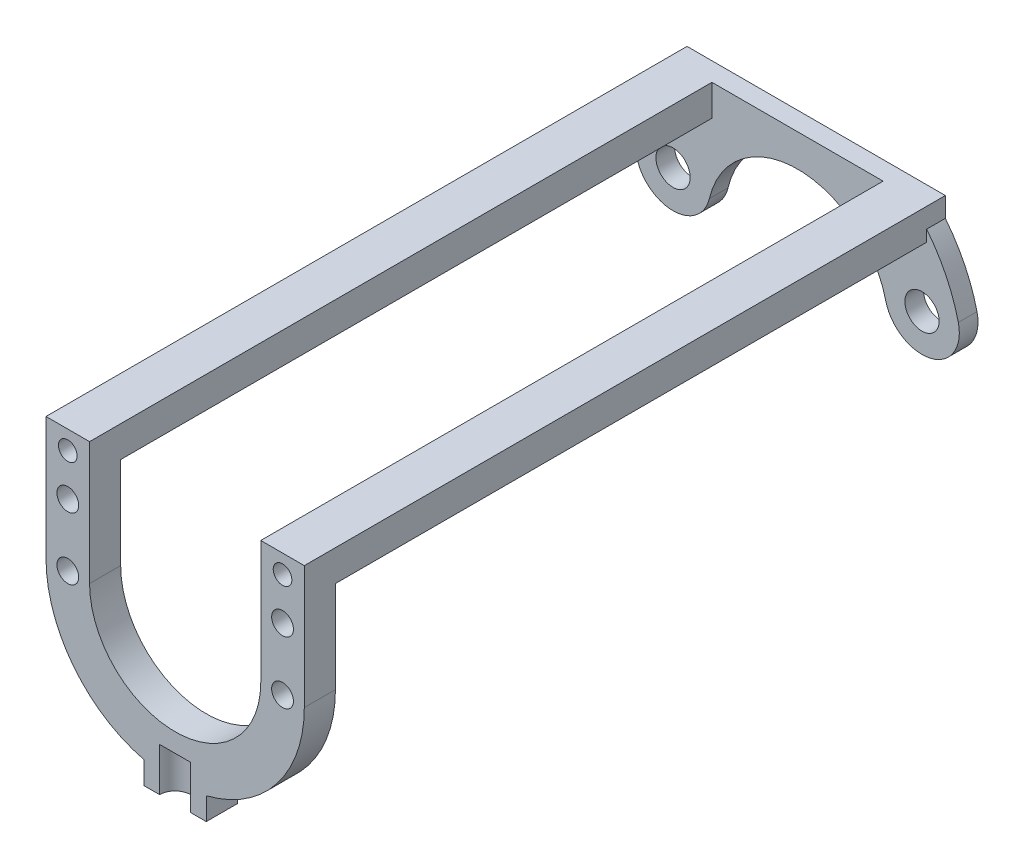
ISO-10303-21;
HEADER;
FILE_DESCRIPTION(('STEP AP214'),'2;1');
FILE_NAME('part.step','',(''),(''),'','','');
FILE_SCHEMA(('AUTOMOTIVE_DESIGN { 1 0 10303 214 1 1 1 1 }'));
ENDSEC;
DATA;
#1=APPLICATION_CONTEXT('core data for automotive mechanical design processes');
#2=APPLICATION_PROTOCOL_DEFINITION('international standard','automotive_design',2000,#1);
#3=PRODUCT_CONTEXT('',#1,'mechanical');
#4=PRODUCT('Part','Part','',(#3));
#5=PRODUCT_RELATED_PRODUCT_CATEGORY('part','',(#4));
#6=PRODUCT_DEFINITION_FORMATION('','',#4);
#7=PRODUCT_DEFINITION_CONTEXT('part definition',#1,'design');
#8=PRODUCT_DEFINITION('design','',#6,#7);
#9=PRODUCT_DEFINITION_SHAPE('','',#8);
#10=(LENGTH_UNIT() NAMED_UNIT(*) SI_UNIT(.MILLI.,.METRE.));
#11=(NAMED_UNIT(*) PLANE_ANGLE_UNIT() SI_UNIT($,.RADIAN.));
#12=(NAMED_UNIT(*) SI_UNIT($,.STERADIAN.) SOLID_ANGLE_UNIT());
#13=UNCERTAINTY_MEASURE_WITH_UNIT(LENGTH_MEASURE(1.E-05),#10,'distance_accuracy_value','');
#14=(GEOMETRIC_REPRESENTATION_CONTEXT(3) GLOBAL_UNCERTAINTY_ASSIGNED_CONTEXT((#13)) GLOBAL_UNIT_ASSIGNED_CONTEXT((#10,
#11,#12)) REPRESENTATION_CONTEXT('',''));
#15=CARTESIAN_POINT('',(0.,0.,0.));
#16=DIRECTION('',(0.,0.,1.));
#17=DIRECTION('',(1.,0.,0.));
#18=AXIS2_PLACEMENT_3D('',#15,#16,#17);
#19=CARTESIAN_POINT('',(0.,0.,103.));
#20=DIRECTION('',(0.,0.,1.));
#21=DIRECTION('',(1.,0.,0.));
#22=AXIS2_PLACEMENT_3D('',#19,#20,#21);
#23=PLANE('',#22);
#24=DIRECTION('',(0.,-1.,0.));
#25=VECTOR('',#24,1.);
#26=CARTESIAN_POINT('',(-2.5,-16.753194099318,103.));
#27=LINE('',#26,#25);
#28=CARTESIAN_POINT('',(-2.5,-16.753194099318,103.));
#29=VERTEX_POINT('',#28);
#30=CARTESIAN_POINT('',(-2.5,-23.753194099318,103.));
#31=VERTEX_POINT('',#30);
#32=EDGE_CURVE('E54',#29,#31,#27,.T.);
#33=ORIENTED_EDGE('',*,*,#32,.F.);
#34=DIRECTION('',(1.,0.,0.));
#35=VECTOR('',#34,1.);
#36=CARTESIAN_POINT('',(0.,-16.753194099318,103.));
#37=LINE('',#36,#35);
#38=CARTESIAN_POINT('',(2.5,-16.753194099318,103.));
#39=VERTEX_POINT('',#38);
#40=EDGE_CURVE('E11',#29,#39,#37,.T.);
#41=ORIENTED_EDGE('',*,*,#40,.T.);
#42=DIRECTION('',(0.,-1.,0.));
#43=VECTOR('',#42,1.);
#44=CARTESIAN_POINT('',(2.5,-16.753194099318,103.));
#45=LINE('',#44,#43);
#46=CARTESIAN_POINT('',(2.5,-23.753194099318,103.));
#47=VERTEX_POINT('',#46);
#48=EDGE_CURVE('E201',#47,#39,#45,.F.);
#49=ORIENTED_EDGE('',*,*,#48,.F.);
#50=DIRECTION('',(1.,0.,0.));
#51=VECTOR('',#50,1.);
#52=CARTESIAN_POINT('',(0.,-23.753194099318,103.));
#53=LINE('',#52,#51);
#54=CARTESIAN_POINT('',(5.,-23.753194099318,103.));
#55=VERTEX_POINT('',#54);
#56=EDGE_CURVE('E252',#47,#55,#53,.T.);
#57=ORIENTED_EDGE('',*,*,#56,.T.);
#58=DIRECTION('',(0.,-1.,0.));
#59=VECTOR('',#58,1.);
#60=CARTESIAN_POINT('',(5.,0.,103.));
#61=LINE('',#60,#59);
#62=CARTESIAN_POINT('',(5.,-20.1418734313363,103.));
#63=VERTEX_POINT('',#62);
#64=EDGE_CURVE('E283',#63,#55,#61,.T.);
#65=ORIENTED_EDGE('',*,*,#64,.F.);
#66=CARTESIAN_POINT('',(0.,0.,103.));
#67=DIRECTION('',(0.,0.,1.));
#68=DIRECTION('',(1.,0.,0.));
#69=AXIS2_PLACEMENT_3D('',#66,#67,#68);
#70=CIRCLE('',#69,20.753194099318);
#71=CARTESIAN_POINT('',(20.753194099318,0.,103.));
#72=VERTEX_POINT('',#71);
#73=EDGE_CURVE('E286',#63,#72,#70,.T.);
#74=ORIENTED_EDGE('',*,*,#73,.T.);
#75=DIRECTION('',(0.,1.,0.));
#76=VECTOR('',#75,1.);
#77=CARTESIAN_POINT('',(20.753194099318,19.75,103.));
#78=LINE('',#77,#76);
#79=CARTESIAN_POINT('',(20.753194099318,19.75,103.));
#80=VERTEX_POINT('',#79);
#81=EDGE_CURVE('E319',#72,#80,#78,.T.);
#82=ORIENTED_EDGE('',*,*,#81,.T.);
#83=DIRECTION('',(-1.,0.,0.));
#84=VECTOR('',#83,1.);
#85=CARTESIAN_POINT('',(20.753194099318,19.75,103.));
#86=LINE('',#85,#84);
#87=CARTESIAN_POINT('',(13.753194099318,19.75,103.));
#88=VERTEX_POINT('',#87);
#89=EDGE_CURVE('E322',#80,#88,#86,.T.);
#90=ORIENTED_EDGE('',*,*,#89,.T.);
#91=DIRECTION('',(0.,-1.,0.));
#92=VECTOR('',#91,1.);
#93=CARTESIAN_POINT('',(13.753194099318,19.75,103.));
#94=LINE('',#93,#92);
#95=CARTESIAN_POINT('',(13.753194099318,0.,103.));
#96=VERTEX_POINT('',#95);
#97=EDGE_CURVE('E325',#88,#96,#94,.T.);
#98=ORIENTED_EDGE('',*,*,#97,.T.);
#99=CARTESIAN_POINT('',(0.,0.,103.));
#100=DIRECTION('',(0.,0.,1.));
#101=DIRECTION('',(1.,0.,0.));
#102=AXIS2_PLACEMENT_3D('',#99,#100,#101);
#103=CIRCLE('',#102,13.753194099318);
#104=CARTESIAN_POINT('',(-13.753194099318,0.,103.));
#105=VERTEX_POINT('',#104);
#106=EDGE_CURVE('E289',#105,#96,#103,.T.);
#107=ORIENTED_EDGE('',*,*,#106,.F.);
#108=DIRECTION('',(0.,1.,0.));
#109=VECTOR('',#108,1.);
#110=CARTESIAN_POINT('',(-13.753194099318,19.75,103.));
#111=LINE('',#110,#109);
#112=CARTESIAN_POINT('',(-13.753194099318,19.75,103.));
#113=VERTEX_POINT('',#112);
#114=EDGE_CURVE('E339',#105,#113,#111,.T.);
#115=ORIENTED_EDGE('',*,*,#114,.T.);
#116=DIRECTION('',(-1.,0.,0.));
#117=VECTOR('',#116,1.);
#118=CARTESIAN_POINT('',(-20.753194099318,19.75,103.));
#119=LINE('',#118,#117);
#120=CARTESIAN_POINT('',(-20.753194099318,19.75,103.));
#121=VERTEX_POINT('',#120);
#122=EDGE_CURVE('E342',#113,#121,#119,.T.);
#123=ORIENTED_EDGE('',*,*,#122,.T.);
#124=DIRECTION('',(0.,-1.,0.));
#125=VECTOR('',#124,1.);
#126=CARTESIAN_POINT('',(-20.753194099318,19.75,103.));
#127=LINE('',#126,#125);
#128=CARTESIAN_POINT('',(-20.753194099318,0.,103.));
#129=VERTEX_POINT('',#128);
#130=EDGE_CURVE('E337',#121,#129,#127,.T.);
#131=ORIENTED_EDGE('',*,*,#130,.T.);
#132=CARTESIAN_POINT('',(0.,0.,103.));
#133=DIRECTION('',(0.,0.,1.));
#134=DIRECTION('',(1.,0.,0.));
#135=AXIS2_PLACEMENT_3D('',#132,#133,#134);
#136=CIRCLE('',#135,20.753194099318);
#137=CARTESIAN_POINT('',(-5.,-20.1418734313363,103.));
#138=VERTEX_POINT('',#137);
#139=EDGE_CURVE('E292',#129,#138,#136,.T.);
#140=ORIENTED_EDGE('',*,*,#139,.T.);
#141=DIRECTION('',(0.,-1.,0.));
#142=VECTOR('',#141,1.);
#143=CARTESIAN_POINT('',(-5.,0.,103.));
#144=LINE('',#143,#142);
#145=CARTESIAN_POINT('',(-5.,-23.753194099318,103.));
#146=VERTEX_POINT('',#145);
#147=EDGE_CURVE('E259',#138,#146,#144,.T.);
#148=ORIENTED_EDGE('',*,*,#147,.T.);
#149=EDGE_CURVE('E215',#146,#31,#53,.T.);
#150=ORIENTED_EDGE('',*,*,#149,.T.);
#151=EDGE_LOOP('',(#33,#41,#49,#57,#65,#74,#82,#90,#98,#107,#115,#123,#131,#140,#148,#150));
#152=FACE_BOUND('',#151,.T.);
#153=CARTESIAN_POINT('',(-17.253194099318,16.75,103.));
#154=DIRECTION('',(0.,0.,1.));
#155=DIRECTION('',(1.,0.,0.));
#156=AXIS2_PLACEMENT_3D('',#153,#154,#155);
#157=CIRCLE('',#156,1.5);
#158=CARTESIAN_POINT('',(-15.753194099318,16.75,103.));
#159=VERTEX_POINT('',#158);
#160=EDGE_CURVE('E226',#159,#159,#157,.T.);
#161=ORIENTED_EDGE('',*,*,#160,.F.);
#162=EDGE_LOOP('',(#161));
#163=FACE_BOUND('',#162,.T.);
#164=CARTESIAN_POINT('',(17.253194099318,16.75,103.));
#165=DIRECTION('',(0.,0.,1.));
#166=DIRECTION('',(1.,0.,0.));
#167=AXIS2_PLACEMENT_3D('',#164,#165,#166);
#168=CIRCLE('',#167,1.5);
#169=CARTESIAN_POINT('',(18.753194099318,16.75,103.));
#170=VERTEX_POINT('',#169);
#171=EDGE_CURVE('E216',#170,#170,#168,.T.);
#172=ORIENTED_EDGE('',*,*,#171,.F.);
#173=EDGE_LOOP('',(#172));
#174=FACE_BOUND('',#173,.T.);
#175=CARTESIAN_POINT('',(17.253194099318,10.,103.));
#176=DIRECTION('',(0.,0.,1.));
#177=DIRECTION('',(1.,0.,0.));
#178=AXIS2_PLACEMENT_3D('',#175,#176,#177);
#179=CIRCLE('',#178,1.75);
#180=CARTESIAN_POINT('',(19.003194099318,10.,103.));
#181=VERTEX_POINT('',#180);
#182=EDGE_CURVE('E235',#181,#181,#179,.F.);
#183=ORIENTED_EDGE('',*,*,#182,.T.);
#184=EDGE_LOOP('',(#183));
#185=FACE_BOUND('',#184,.T.);
#186=CARTESIAN_POINT('',(-17.253194099318,10.0000000000001,103.));
#187=DIRECTION('',(0.,0.,1.));
#188=DIRECTION('',(1.,0.,0.));
#189=AXIS2_PLACEMENT_3D('',#186,#187,#188);
#190=CIRCLE('',#189,1.75);
#191=CARTESIAN_POINT('',(-15.503194099318,10.0000000000001,103.));
#192=VERTEX_POINT('',#191);
#193=EDGE_CURVE('E234',#192,#192,#190,.F.);
#194=ORIENTED_EDGE('',*,*,#193,.T.);
#195=EDGE_LOOP('',(#194));
#196=FACE_BOUND('',#195,.T.);
#197=CARTESIAN_POINT('',(17.253194099318,0.,103.));
#198=DIRECTION('',(0.,0.,1.));
#199=DIRECTION('',(1.,0.,0.));
#200=AXIS2_PLACEMENT_3D('',#197,#198,#199);
#201=CIRCLE('',#200,1.75);
#202=CARTESIAN_POINT('',(19.003194099318,0.,103.));
#203=VERTEX_POINT('',#202);
#204=EDGE_CURVE('E241',#203,#203,#201,.T.);
#205=ORIENTED_EDGE('',*,*,#204,.F.);
#206=EDGE_LOOP('',(#205));
#207=FACE_BOUND('',#206,.T.);
#208=CARTESIAN_POINT('',(-17.253194099318,0.,103.));
#209=DIRECTION('',(0.,0.,1.));
#210=DIRECTION('',(1.,0.,0.));
#211=AXIS2_PLACEMENT_3D('',#208,#209,#210);
#212=CIRCLE('',#211,1.75);
#213=CARTESIAN_POINT('',(-15.503194099318,0.,103.));
#214=VERTEX_POINT('',#213);
#215=EDGE_CURVE('E225',#214,#214,#212,.T.);
#216=ORIENTED_EDGE('',*,*,#215,.F.);
#217=EDGE_LOOP('',(#216));
#218=FACE_BOUND('',#217,.T.);
#219=ADVANCED_FACE('F39',(#152,#163,#174,#185,#196,#207,#218),#23,.T.);
#220=CARTESIAN_POINT('',(0.,0.,98.));
#221=DIRECTION('',(0.,0.,1.));
#222=DIRECTION('',(1.,0.,0.));
#223=AXIS2_PLACEMENT_3D('',#220,#221,#222);
#224=PLANE('',#223);
#225=CARTESIAN_POINT('',(17.253194099318,0.,98.));
#226=DIRECTION('',(0.,0.,1.));
#227=DIRECTION('',(1.,0.,0.));
#228=AXIS2_PLACEMENT_3D('',#225,#226,#227);
#229=CIRCLE('',#228,1.75);
#230=CARTESIAN_POINT('',(19.003194099318,0.,98.));
#231=VERTEX_POINT('',#230);
#232=EDGE_CURVE('E238',#231,#231,#229,.T.);
#233=ORIENTED_EDGE('',*,*,#232,.T.);
#234=EDGE_LOOP('',(#233));
#235=FACE_BOUND('',#234,.T.);
#236=CARTESIAN_POINT('',(17.253194099318,10.,98.));
#237=DIRECTION('',(0.,0.,1.));
#238=DIRECTION('',(1.,0.,0.));
#239=AXIS2_PLACEMENT_3D('',#236,#237,#238);
#240=CIRCLE('',#239,1.75);
#241=CARTESIAN_POINT('',(19.003194099318,10.,98.));
#242=VERTEX_POINT('',#241);
#243=EDGE_CURVE('E231',#242,#242,#240,.F.);
#244=ORIENTED_EDGE('',*,*,#243,.F.);
#245=EDGE_LOOP('',(#244));
#246=FACE_BOUND('',#245,.T.);
#247=CARTESIAN_POINT('',(-17.253194099318,10.0000000000001,98.));
#248=DIRECTION('',(0.,0.,1.));
#249=DIRECTION('',(1.,0.,0.));
#250=AXIS2_PLACEMENT_3D('',#247,#248,#249);
#251=CIRCLE('',#250,1.75);
#252=CARTESIAN_POINT('',(-15.503194099318,10.0000000000001,98.));
#253=VERTEX_POINT('',#252);
#254=EDGE_CURVE('E249',#253,#253,#251,.F.);
#255=ORIENTED_EDGE('',*,*,#254,.F.);
#256=EDGE_LOOP('',(#255));
#257=FACE_BOUND('',#256,.T.);
#258=DIRECTION('',(0.,-1.,0.));
#259=VECTOR('',#258,1.);
#260=CARTESIAN_POINT('',(-20.753194099318,0.,98.));
#261=LINE('',#260,#259);
#262=CARTESIAN_POINT('',(-20.753194099318,14.75,98.));
#263=VERTEX_POINT('',#262);
#264=CARTESIAN_POINT('',(-20.753194099318,0.,98.));
#265=VERTEX_POINT('',#264);
#266=EDGE_CURVE('E273',#263,#265,#261,.T.);
#267=ORIENTED_EDGE('',*,*,#266,.F.);
#268=DIRECTION('',(1.,0.,0.));
#269=VECTOR('',#268,1.);
#270=CARTESIAN_POINT('',(-20.753194099318,14.75,98.));
#271=LINE('',#270,#269);
#272=CARTESIAN_POINT('',(-13.753194099318,14.75,98.));
#273=VERTEX_POINT('',#272);
#274=EDGE_CURVE('E298',#263,#273,#271,.T.);
#275=ORIENTED_EDGE('',*,*,#274,.T.);
#276=DIRECTION('',(0.,-1.,0.));
#277=VECTOR('',#276,1.);
#278=CARTESIAN_POINT('',(-13.753194099318,0.,98.));
#279=LINE('',#278,#277);
#280=CARTESIAN_POINT('',(-13.753194099318,0.,98.));
#281=VERTEX_POINT('',#280);
#282=EDGE_CURVE('E271',#273,#281,#279,.T.);
#283=ORIENTED_EDGE('',*,*,#282,.T.);
#284=CARTESIAN_POINT('',(0.,0.,98.));
#285=DIRECTION('',(0.,0.,1.));
#286=DIRECTION('',(1.,0.,0.));
#287=AXIS2_PLACEMENT_3D('',#284,#285,#286);
#288=CIRCLE('',#287,13.753194099318);
#289=CARTESIAN_POINT('',(13.753194099318,0.,98.));
#290=VERTEX_POINT('',#289);
#291=EDGE_CURVE('E268',#281,#290,#288,.T.);
#292=ORIENTED_EDGE('',*,*,#291,.T.);
#293=DIRECTION('',(0.,-1.,0.));
#294=VECTOR('',#293,1.);
#295=CARTESIAN_POINT('',(13.753194099318,0.,98.));
#296=LINE('',#295,#294);
#297=CARTESIAN_POINT('',(13.753194099318,14.75,98.));
#298=VERTEX_POINT('',#297);
#299=EDGE_CURVE('E266',#298,#290,#296,.T.);
#300=ORIENTED_EDGE('',*,*,#299,.F.);
#301=DIRECTION('',(1.,0.,0.));
#302=VECTOR('',#301,1.);
#303=CARTESIAN_POINT('',(20.753194099318,14.75,98.));
#304=LINE('',#303,#302);
#305=CARTESIAN_POINT('',(20.753194099318,14.75,98.));
#306=VERTEX_POINT('',#305);
#307=EDGE_CURVE('E349',#298,#306,#304,.T.);
#308=ORIENTED_EDGE('',*,*,#307,.T.);
#309=DIRECTION('',(0.,-1.,0.));
#310=VECTOR('',#309,1.);
#311=CARTESIAN_POINT('',(20.753194099318,0.,98.));
#312=LINE('',#311,#310);
#313=CARTESIAN_POINT('',(20.753194099318,0.,98.));
#314=VERTEX_POINT('',#313);
#315=EDGE_CURVE('E264',#306,#314,#312,.T.);
#316=ORIENTED_EDGE('',*,*,#315,.T.);
#317=CARTESIAN_POINT('',(0.,0.,98.));
#318=DIRECTION('',(0.,0.,1.));
#319=DIRECTION('',(1.,0.,0.));
#320=AXIS2_PLACEMENT_3D('',#317,#318,#319);
#321=CIRCLE('',#320,20.753194099318);
#322=CARTESIAN_POINT('',(5.,-20.1418734313363,98.));
#323=VERTEX_POINT('',#322);
#324=EDGE_CURVE('E261',#323,#314,#321,.T.);
#325=ORIENTED_EDGE('',*,*,#324,.F.);
#326=DIRECTION('',(0.,-1.,0.));
#327=VECTOR('',#326,1.);
#328=CARTESIAN_POINT('',(5.,0.,98.));
#329=LINE('',#328,#327);
#330=CARTESIAN_POINT('',(5.,-23.753194099318,98.));
#331=VERTEX_POINT('',#330);
#332=EDGE_CURVE('E258',#323,#331,#329,.T.);
#333=ORIENTED_EDGE('',*,*,#332,.T.);
#334=DIRECTION('',(1.,0.,0.));
#335=VECTOR('',#334,1.);
#336=CARTESIAN_POINT('',(0.,-23.753194099318,98.));
#337=LINE('',#336,#335);
#338=CARTESIAN_POINT('',(-5.,-23.753194099318,98.));
#339=VERTEX_POINT('',#338);
#340=EDGE_CURVE('E255',#339,#331,#337,.T.);
#341=ORIENTED_EDGE('',*,*,#340,.F.);
#342=DIRECTION('',(0.,-1.,0.));
#343=VECTOR('',#342,1.);
#344=CARTESIAN_POINT('',(-5.,0.,98.));
#345=LINE('',#344,#343);
#346=CARTESIAN_POINT('',(-5.,-20.1418734313363,98.));
#347=VERTEX_POINT('',#346);
#348=EDGE_CURVE('E278',#347,#339,#345,.T.);
#349=ORIENTED_EDGE('',*,*,#348,.F.);
#350=CARTESIAN_POINT('',(0.,0.,98.));
#351=DIRECTION('',(0.,0.,1.));
#352=DIRECTION('',(1.,0.,0.));
#353=AXIS2_PLACEMENT_3D('',#350,#351,#352);
#354=CIRCLE('',#353,20.753194099318);
#355=EDGE_CURVE('E275',#265,#347,#354,.T.);
#356=ORIENTED_EDGE('',*,*,#355,.F.);
#357=EDGE_LOOP('',(#267,#275,#283,#292,#300,#308,#316,#325,#333,#341,#349,#356));
#358=FACE_BOUND('',#357,.T.);
#359=CARTESIAN_POINT('',(-17.253194099318,0.,98.));
#360=DIRECTION('',(0.,0.,1.));
#361=DIRECTION('',(1.,0.,0.));
#362=AXIS2_PLACEMENT_3D('',#359,#360,#361);
#363=CIRCLE('',#362,1.75);
#364=CARTESIAN_POINT('',(-15.503194099318,0.,98.));
#365=VERTEX_POINT('',#364);
#366=EDGE_CURVE('E244',#365,#365,#363,.T.);
#367=ORIENTED_EDGE('',*,*,#366,.T.);
#368=EDGE_LOOP('',(#367));
#369=FACE_BOUND('',#368,.T.);
#370=ADVANCED_FACE('F429',(#235,#246,#257,#358,#369),#224,.F.);
#371=CARTESIAN_POINT('',(-20.753194099318,14.75,103.));
#372=DIRECTION('',(0.,1.,0.));
#373=DIRECTION('',(0.,0.,1.));
#374=AXIS2_PLACEMENT_3D('',#371,#372,#373);
#375=PLANE('',#374);
#376=ORIENTED_EDGE('',*,*,#274,.F.);
#377=DIRECTION('',(0.,0.,-1.));
#378=VECTOR('',#377,1.);
#379=CARTESIAN_POINT('',(-20.753194099318,14.75,103.));
#380=LINE('',#379,#378);
#381=CARTESIAN_POINT('',(-20.753194099318,14.75,3.));
#382=VERTEX_POINT('',#381);
#383=EDGE_CURVE('E358',#263,#382,#380,.T.);
#384=ORIENTED_EDGE('',*,*,#383,.T.);
#385=DIRECTION('',(1.,0.,0.));
#386=VECTOR('',#385,1.);
#387=CARTESIAN_POINT('',(-20.753194099318,14.75,3.));
#388=LINE('',#387,#386);
#389=CARTESIAN_POINT('',(-13.753194099318,14.75,3.));
#390=VERTEX_POINT('',#389);
#391=EDGE_CURVE('E336',#382,#390,#388,.T.);
#392=ORIENTED_EDGE('',*,*,#391,.T.);
#393=DIRECTION('',(0.,0.,-1.));
#394=VECTOR('',#393,1.);
#395=CARTESIAN_POINT('',(-13.753194099318,14.75,103.));
#396=LINE('',#395,#394);
#397=EDGE_CURVE('E356',#273,#390,#396,.T.);
#398=ORIENTED_EDGE('',*,*,#397,.F.);
#399=EDGE_LOOP('',(#376,#384,#392,#398));
#400=FACE_BOUND('',#399,.T.);
#401=ADVANCED_FACE('F485',(#400),#375,.F.);
#402=CARTESIAN_POINT('',(20.753194099318,14.75,103.));
#403=DIRECTION('',(0.,1.,0.));
#404=DIRECTION('',(0.,0.,1.));
#405=AXIS2_PLACEMENT_3D('',#402,#403,#404);
#406=PLANE('',#405);
#407=ORIENTED_EDGE('',*,*,#307,.F.);
#408=DIRECTION('',(0.,0.,-1.));
#409=VECTOR('',#408,1.);
#410=CARTESIAN_POINT('',(13.753194099318,14.75,103.));
#411=LINE('',#410,#409);
#412=CARTESIAN_POINT('',(13.753194099318,14.75,3.));
#413=VERTEX_POINT('',#412);
#414=EDGE_CURVE('E62',#298,#413,#411,.T.);
#415=ORIENTED_EDGE('',*,*,#414,.T.);
#416=DIRECTION('',(1.,0.,0.));
#417=VECTOR('',#416,1.);
#418=CARTESIAN_POINT('',(20.753194099318,14.75,3.));
#419=LINE('',#418,#417);
#420=CARTESIAN_POINT('',(20.753194099318,14.75,3.));
#421=VERTEX_POINT('',#420);
#422=EDGE_CURVE('E323',#413,#421,#419,.T.);
#423=ORIENTED_EDGE('',*,*,#422,.T.);
#424=DIRECTION('',(0.,0.,-1.));
#425=VECTOR('',#424,1.);
#426=CARTESIAN_POINT('',(20.753194099318,14.75,103.));
#427=LINE('',#426,#425);
#428=EDGE_CURVE('E327',#306,#421,#427,.T.);
#429=ORIENTED_EDGE('',*,*,#428,.F.);
#430=EDGE_LOOP('',(#407,#415,#423,#429));
#431=FACE_BOUND('',#430,.T.);
#432=ADVANCED_FACE('F436',(#431),#406,.F.);
#433=CARTESIAN_POINT('',(0.,0.,3.));
#434=DIRECTION('',(0.,0.,1.));
#435=DIRECTION('',(1.,0.,0.));
#436=AXIS2_PLACEMENT_3D('',#433,#434,#435);
#437=PLANE('',#436);
#438=CARTESIAN_POINT('',(20.,4.74999999999999,3.));
#439=DIRECTION('',(0.,0.,1.));
#440=DIRECTION('',(1.,0.,0.));
#441=AXIS2_PLACEMENT_3D('',#438,#439,#440);
#442=CIRCLE('',#441,2.75);
#443=CARTESIAN_POINT('',(22.75,4.74999999999999,3.));
#444=VERTEX_POINT('',#443);
#445=EDGE_CURVE('E377',#444,#444,#442,.F.);
#446=ORIENTED_EDGE('',*,*,#445,.T.);
#447=EDGE_LOOP('',(#446));
#448=FACE_BOUND('',#447,.T.);
#449=CARTESIAN_POINT('',(-20.,4.74999999999999,3.));
#450=DIRECTION('',(0.,0.,1.));
#451=DIRECTION('',(1.,0.,0.));
#452=AXIS2_PLACEMENT_3D('',#449,#450,#451);
#453=CIRCLE('',#452,2.75);
#454=CARTESIAN_POINT('',(-17.25,4.74999999999999,3.));
#455=VERTEX_POINT('',#454);
#456=EDGE_CURVE('E380',#455,#455,#453,.F.);
#457=ORIENTED_EDGE('',*,*,#456,.T.);
#458=EDGE_LOOP('',(#457));
#459=FACE_BOUND('',#458,.T.);
#460=CARTESIAN_POINT('',(0.,0.,3.));
#461=DIRECTION('',(0.,0.,1.));
#462=DIRECTION('',(1.,0.,0.));
#463=AXIS2_PLACEMENT_3D('',#460,#461,#462);
#464=CIRCLE('',#463,26.5563250606717);
#465=CARTESIAN_POINT('',(25.8376193043174,6.13643458477537,3.));
#466=VERTEX_POINT('',#465);
#467=CARTESIAN_POINT('',(20.753194099318,16.5693492752157,3.));
#468=VERTEX_POINT('',#467);
#469=EDGE_CURVE('E371',#466,#468,#464,.T.);
#470=ORIENTED_EDGE('',*,*,#469,.T.);
#471=DIRECTION('',(0.,1.,0.));
#472=VECTOR('',#471,1.);
#473=CARTESIAN_POINT('',(20.753194099318,19.75,3.));
#474=LINE('',#473,#472);
#475=EDGE_CURVE('E318',#421,#468,#474,.T.);
#476=ORIENTED_EDGE('',*,*,#475,.F.);
#477=ORIENTED_EDGE('',*,*,#422,.F.);
#478=DIRECTION('',(0.,-1.,0.));
#479=VECTOR('',#478,1.);
#480=CARTESIAN_POINT('',(13.753194099318,19.75,3.));
#481=LINE('',#480,#479);
#482=CARTESIAN_POINT('',(13.753194099318,19.75,3.));
#483=VERTEX_POINT('',#482);
#484=EDGE_CURVE('E329',#483,#413,#481,.T.);
#485=ORIENTED_EDGE('',*,*,#484,.F.);
#486=DIRECTION('',(1.,0.,0.));
#487=VECTOR('',#486,1.);
#488=CARTESIAN_POINT('',(0.,19.75,3.));
#489=LINE('',#488,#487);
#490=CARTESIAN_POINT('',(-13.753194099318,19.75,3.));
#491=VERTEX_POINT('',#490);
#492=EDGE_CURVE('E374',#491,#483,#489,.T.);
#493=ORIENTED_EDGE('',*,*,#492,.F.);
#494=DIRECTION('',(0.,1.,0.));
#495=VECTOR('',#494,1.);
#496=CARTESIAN_POINT('',(-13.753194099318,19.75,3.));
#497=LINE('',#496,#495);
#498=EDGE_CURVE('E340',#390,#491,#497,.T.);
#499=ORIENTED_EDGE('',*,*,#498,.F.);
#500=ORIENTED_EDGE('',*,*,#391,.F.);
#501=DIRECTION('',(0.,-1.,0.));
#502=VECTOR('',#501,1.);
#503=CARTESIAN_POINT('',(-20.753194099318,19.75,3.));
#504=LINE('',#503,#502);
#505=CARTESIAN_POINT('',(-20.753194099318,16.5693492752157,3.));
#506=VERTEX_POINT('',#505);
#507=EDGE_CURVE('E346',#506,#382,#504,.T.);
#508=ORIENTED_EDGE('',*,*,#507,.F.);
#509=CARTESIAN_POINT('',(0.,0.,3.));
#510=DIRECTION('',(0.,0.,1.));
#511=DIRECTION('',(1.,0.,0.));
#512=AXIS2_PLACEMENT_3D('',#509,#510,#511);
#513=CIRCLE('',#512,26.5563250606717);
#514=CARTESIAN_POINT('',(-25.8376193043174,6.13643458477536,3.));
#515=VERTEX_POINT('',#514);
#516=EDGE_CURVE('E361',#506,#515,#513,.T.);
#517=ORIENTED_EDGE('',*,*,#516,.T.);
#518=CARTESIAN_POINT('',(-20.,4.74999999999999,3.));
#519=DIRECTION('',(0.,0.,1.));
#520=DIRECTION('',(1.,0.,0.));
#521=AXIS2_PLACEMENT_3D('',#518,#519,#520);
#522=CIRCLE('',#521,6.);
#523=CARTESIAN_POINT('',(-14.1623806956826,3.36356541522462,3.));
#524=VERTEX_POINT('',#523);
#525=EDGE_CURVE('E363',#515,#524,#522,.T.);
#526=ORIENTED_EDGE('',*,*,#525,.T.);
#527=CARTESIAN_POINT('',(0.,0.,3.));
#528=DIRECTION('',(0.,0.,1.));
#529=DIRECTION('',(1.,0.,0.));
#530=AXIS2_PLACEMENT_3D('',#527,#528,#529);
#531=CIRCLE('',#530,14.5563250606717);
#532=CARTESIAN_POINT('',(14.1623806956826,3.36356541522462,3.));
#533=VERTEX_POINT('',#532);
#534=EDGE_CURVE('E366',#533,#524,#531,.T.);
#535=ORIENTED_EDGE('',*,*,#534,.F.);
#536=CARTESIAN_POINT('',(20.,4.74999999999999,3.));
#537=DIRECTION('',(0.,0.,1.));
#538=DIRECTION('',(1.,0.,0.));
#539=AXIS2_PLACEMENT_3D('',#536,#537,#538);
#540=CIRCLE('',#539,6.);
#541=EDGE_CURVE('E369',#533,#466,#540,.T.);
#542=ORIENTED_EDGE('',*,*,#541,.T.);
#543=EDGE_LOOP('',(#470,#476,#477,#485,#493,#499,#500,#508,#517,#526,#535,#542));
#544=FACE_BOUND('',#543,.T.);
#545=ADVANCED_FACE('F441',(#448,#459,#544),#437,.T.);
#546=CARTESIAN_POINT('',(-20.753194099318,0.,3.));
#547=DIRECTION('',(1.,0.,0.));
#548=DIRECTION('',(0.,1.,0.));
#549=AXIS2_PLACEMENT_3D('',#546,#547,#548);
#550=PLANE('',#549);
#551=DIRECTION('',(0.,0.,-1.));
#552=VECTOR('',#551,1.);
#553=CARTESIAN_POINT('',(-20.753194099318,19.75,3.));
#554=LINE('',#553,#552);
#555=CARTESIAN_POINT('',(-20.753194099318,19.75,0.));
#556=VERTEX_POINT('',#555);
#557=EDGE_CURVE('E383',#121,#556,#554,.T.);
#558=ORIENTED_EDGE('',*,*,#557,.T.);
#559=DIRECTION('',(0.,-1.,0.));
#560=VECTOR('',#559,1.);
#561=CARTESIAN_POINT('',(-20.753194099318,0.,0.));
#562=LINE('',#561,#560);
#563=CARTESIAN_POINT('',(-20.753194099318,16.5693492752157,0.));
#564=VERTEX_POINT('',#563);
#565=EDGE_CURVE('E360',#556,#564,#562,.T.);
#566=ORIENTED_EDGE('',*,*,#565,.T.);
#567=DIRECTION('',(0.,0.,-1.));
#568=VECTOR('',#567,1.);
#569=CARTESIAN_POINT('',(-20.753194099318,16.5693492752157,3.));
#570=LINE('',#569,#568);
#571=EDGE_CURVE('E350',#506,#564,#570,.T.);
#572=ORIENTED_EDGE('',*,*,#571,.F.);
#573=ORIENTED_EDGE('',*,*,#507,.T.);
#574=ORIENTED_EDGE('',*,*,#383,.F.);
#575=ORIENTED_EDGE('',*,*,#266,.T.);
#576=DIRECTION('',(0.,0.,1.));
#577=VECTOR('',#576,1.);
#578=CARTESIAN_POINT('',(-20.753194099318,0.,98.));
#579=LINE('',#578,#577);
#580=EDGE_CURVE('E301',#265,#129,#579,.T.);
#581=ORIENTED_EDGE('',*,*,#580,.T.);
#582=ORIENTED_EDGE('',*,*,#130,.F.);
#583=EDGE_LOOP('',(#558,#566,#572,#573,#574,#575,#581,#582));
#584=FACE_BOUND('',#583,.T.);
#585=ADVANCED_FACE('F41',(#584),#550,.F.);
#586=CARTESIAN_POINT('',(0.,0.,3.));
#587=DIRECTION('',(0.,0.,-1.));
#588=DIRECTION('',(-1.,0.,0.));
#589=AXIS2_PLACEMENT_3D('',#586,#587,#588);
#590=CYLINDRICAL_SURFACE('',#589,26.5563250606717);
#591=CARTESIAN_POINT('',(0.,0.,0.));
#592=DIRECTION('',(0.,0.,1.));
#593=DIRECTION('',(1.,0.,0.));
#594=AXIS2_PLACEMENT_3D('',#591,#592,#593);
#595=CIRCLE('',#594,26.5563250606717);
#596=CARTESIAN_POINT('',(-25.8376193043174,6.13643458477536,0.));
#597=VERTEX_POINT('',#596);
#598=EDGE_CURVE('E386',#564,#597,#595,.T.);
#599=ORIENTED_EDGE('',*,*,#598,.T.);
#600=DIRECTION('',(0.,0.,-1.));
#601=VECTOR('',#600,1.);
#602=CARTESIAN_POINT('',(-25.8376193043174,6.13643458477536,3.));
#603=LINE('',#602,#601);
#604=EDGE_CURVE('E422',#515,#597,#603,.T.);
#605=ORIENTED_EDGE('',*,*,#604,.F.);
#606=ORIENTED_EDGE('',*,*,#516,.F.);
#607=ORIENTED_EDGE('',*,*,#571,.T.);
#608=EDGE_LOOP('',(#599,#605,#606,#607));
#609=FACE_BOUND('',#608,.T.);
#610=ADVANCED_FACE('F492',(#609),#590,.T.);
#611=CARTESIAN_POINT('',(-20.,4.74999999999999,3.));
#612=DIRECTION('',(0.,0.,-1.));
#613=DIRECTION('',(-1.,0.,0.));
#614=AXIS2_PLACEMENT_3D('',#611,#612,#613);
#615=CYLINDRICAL_SURFACE('',#614,6.);
#616=CARTESIAN_POINT('',(-20.,4.74999999999999,0.));
#617=DIRECTION('',(0.,0.,1.));
#618=DIRECTION('',(1.,0.,0.));
#619=AXIS2_PLACEMENT_3D('',#616,#617,#618);
#620=CIRCLE('',#619,6.);
#621=CARTESIAN_POINT('',(-14.1623806956826,3.36356541522462,0.));
#622=VERTEX_POINT('',#621);
#623=EDGE_CURVE('E388',#597,#622,#620,.T.);
#624=ORIENTED_EDGE('',*,*,#623,.T.);
#625=DIRECTION('',(0.,0.,-1.));
#626=VECTOR('',#625,1.);
#627=CARTESIAN_POINT('',(-14.1623806956826,3.36356541522462,3.));
#628=LINE('',#627,#626);
#629=EDGE_CURVE('E420',#524,#622,#628,.T.);
#630=ORIENTED_EDGE('',*,*,#629,.F.);
#631=ORIENTED_EDGE('',*,*,#525,.F.);
#632=ORIENTED_EDGE('',*,*,#604,.T.);
#633=EDGE_LOOP('',(#624,#630,#631,#632));
#634=FACE_BOUND('',#633,.T.);
#635=ADVANCED_FACE('F497',(#634),#615,.T.);
#636=CARTESIAN_POINT('',(0.,0.,3.));
#637=DIRECTION('',(0.,0.,-1.));
#638=DIRECTION('',(-1.,0.,0.));
#639=AXIS2_PLACEMENT_3D('',#636,#637,#638);
#640=CYLINDRICAL_SURFACE('',#639,14.5563250606717);
#641=CARTESIAN_POINT('',(0.,0.,0.));
#642=DIRECTION('',(0.,0.,1.));
#643=DIRECTION('',(1.,0.,0.));
#644=AXIS2_PLACEMENT_3D('',#641,#642,#643);
#645=CIRCLE('',#644,14.5563250606717);
#646=CARTESIAN_POINT('',(14.1623806956826,3.36356541522462,0.));
#647=VERTEX_POINT('',#646);
#648=EDGE_CURVE('E391',#647,#622,#645,.T.);
#649=ORIENTED_EDGE('',*,*,#648,.F.);
#650=DIRECTION('',(0.,0.,-1.));
#651=VECTOR('',#650,1.);
#652=CARTESIAN_POINT('',(14.1623806956826,3.36356541522462,3.));
#653=LINE('',#652,#651);
#654=EDGE_CURVE('E418',#533,#647,#653,.T.);
#655=ORIENTED_EDGE('',*,*,#654,.F.);
#656=ORIENTED_EDGE('',*,*,#534,.T.);
#657=ORIENTED_EDGE('',*,*,#629,.T.);
#658=EDGE_LOOP('',(#649,#655,#656,#657));
#659=FACE_BOUND('',#658,.T.);
#660=ADVANCED_FACE('F502',(#659),#640,.F.);
#661=CARTESIAN_POINT('',(20.,4.74999999999999,3.));
#662=DIRECTION('',(0.,0.,-1.));
#663=DIRECTION('',(-1.,0.,0.));
#664=AXIS2_PLACEMENT_3D('',#661,#662,#663);
#665=CYLINDRICAL_SURFACE('',#664,6.);
#666=CARTESIAN_POINT('',(20.,4.74999999999999,0.));
#667=DIRECTION('',(0.,0.,1.));
#668=DIRECTION('',(1.,0.,0.));
#669=AXIS2_PLACEMENT_3D('',#666,#667,#668);
#670=CIRCLE('',#669,6.);
#671=CARTESIAN_POINT('',(25.8376193043174,6.13643458477537,0.));
#672=VERTEX_POINT('',#671);
#673=EDGE_CURVE('E394',#647,#672,#670,.T.);
#674=ORIENTED_EDGE('',*,*,#673,.T.);
#675=DIRECTION('',(0.,0.,-1.));
#676=VECTOR('',#675,1.);
#677=CARTESIAN_POINT('',(25.8376193043174,6.13643458477537,3.));
#678=LINE('',#677,#676);
#679=EDGE_CURVE('E415',#466,#672,#678,.T.);
#680=ORIENTED_EDGE('',*,*,#679,.F.);
#681=ORIENTED_EDGE('',*,*,#541,.F.);
#682=ORIENTED_EDGE('',*,*,#654,.T.);
#683=EDGE_LOOP('',(#674,#680,#681,#682));
#684=FACE_BOUND('',#683,.T.);
#685=ADVANCED_FACE('F504',(#684),#665,.T.);
#686=CARTESIAN_POINT('',(0.,0.,3.));
#687=DIRECTION('',(0.,0.,-1.));
#688=DIRECTION('',(-1.,0.,0.));
#689=AXIS2_PLACEMENT_3D('',#686,#687,#688);
#690=CYLINDRICAL_SURFACE('',#689,26.5563250606717);
#691=CARTESIAN_POINT('',(0.,0.,0.));
#692=DIRECTION('',(0.,0.,1.));
#693=DIRECTION('',(1.,0.,0.));
#694=AXIS2_PLACEMENT_3D('',#691,#692,#693);
#695=CIRCLE('',#694,26.5563250606717);
#696=CARTESIAN_POINT('',(20.753194099318,16.5693492752157,0.));
#697=VERTEX_POINT('',#696);
#698=EDGE_CURVE('E396',#672,#697,#695,.T.);
#699=ORIENTED_EDGE('',*,*,#698,.T.);
#700=DIRECTION('',(0.,0.,-1.));
#701=VECTOR('',#700,1.);
#702=CARTESIAN_POINT('',(20.753194099318,16.5693492752157,3.));
#703=LINE('',#702,#701);
#704=EDGE_CURVE('E413',#468,#697,#703,.T.);
#705=ORIENTED_EDGE('',*,*,#704,.F.);
#706=ORIENTED_EDGE('',*,*,#469,.F.);
#707=ORIENTED_EDGE('',*,*,#679,.T.);
#708=EDGE_LOOP('',(#699,#705,#706,#707));
#709=FACE_BOUND('',#708,.T.);
#710=ADVANCED_FACE('F447',(#709),#690,.T.);
#711=CARTESIAN_POINT('',(20.753194099318,0.,3.));
#712=DIRECTION('',(1.,0.,0.));
#713=DIRECTION('',(0.,0.,-1.));
#714=AXIS2_PLACEMENT_3D('',#711,#712,#713);
#715=PLANE('',#714);
#716=ORIENTED_EDGE('',*,*,#315,.F.);
#717=ORIENTED_EDGE('',*,*,#428,.T.);
#718=ORIENTED_EDGE('',*,*,#475,.T.);
#719=ORIENTED_EDGE('',*,*,#704,.T.);
#720=DIRECTION('',(0.,-1.,0.));
#721=VECTOR('',#720,1.);
#722=CARTESIAN_POINT('',(20.753194099318,0.,0.));
#723=LINE('',#722,#721);
#724=CARTESIAN_POINT('',(20.753194099318,19.75,0.));
#725=VERTEX_POINT('',#724);
#726=EDGE_CURVE('E399',#725,#697,#723,.T.);
#727=ORIENTED_EDGE('',*,*,#726,.F.);
#728=DIRECTION('',(0.,0.,-1.));
#729=VECTOR('',#728,1.);
#730=CARTESIAN_POINT('',(20.753194099318,19.75,3.));
#731=LINE('',#730,#729);
#732=EDGE_CURVE('E411',#80,#725,#731,.T.);
#733=ORIENTED_EDGE('',*,*,#732,.F.);
#734=ORIENTED_EDGE('',*,*,#81,.F.);
#735=DIRECTION('',(0.,0.,1.));
#736=VECTOR('',#735,1.);
#737=CARTESIAN_POINT('',(20.753194099318,0.,98.));
#738=LINE('',#737,#736);
#739=EDGE_CURVE('E310',#314,#72,#738,.T.);
#740=ORIENTED_EDGE('',*,*,#739,.F.);
#741=EDGE_LOOP('',(#716,#717,#718,#719,#727,#733,#734,#740));
#742=FACE_BOUND('',#741,.T.);
#743=ADVANCED_FACE('F435',(#742),#715,.T.);
#744=CARTESIAN_POINT('',(20.,4.74999999999999,3.));
#745=DIRECTION('',(0.,0.,-1.));
#746=DIRECTION('',(-1.,0.,0.));
#747=AXIS2_PLACEMENT_3D('',#744,#745,#746);
#748=CYLINDRICAL_SURFACE('',#747,2.75);
#749=ORIENTED_EDGE('',*,*,#445,.F.);
#750=EDGE_LOOP('',(#749));
#751=FACE_BOUND('',#750,.T.);
#752=CARTESIAN_POINT('',(20.,4.74999999999999,0.));
#753=DIRECTION('',(0.,0.,1.));
#754=DIRECTION('',(1.,0.,0.));
#755=AXIS2_PLACEMENT_3D('',#752,#753,#754);
#756=CIRCLE('',#755,2.75);
#757=CARTESIAN_POINT('',(22.75,4.74999999999999,0.));
#758=VERTEX_POINT('',#757);
#759=EDGE_CURVE('E405',#758,#758,#756,.F.);
#760=ORIENTED_EDGE('',*,*,#759,.T.);
#761=EDGE_LOOP('',(#760));
#762=FACE_BOUND('',#761,.T.);
#763=ADVANCED_FACE('F540',(#751,#762),#748,.F.);
#764=CARTESIAN_POINT('',(0.,19.75,3.));
#765=DIRECTION('',(0.,1.,0.));
#766=DIRECTION('',(0.,0.,1.));
#767=AXIS2_PLACEMENT_3D('',#764,#765,#766);
#768=PLANE('',#767);
#769=ORIENTED_EDGE('',*,*,#732,.T.);
#770=DIRECTION('',(1.,0.,0.));
#771=VECTOR('',#770,1.);
#772=CARTESIAN_POINT('',(0.,19.75,0.));
#773=LINE('',#772,#771);
#774=EDGE_CURVE('E402',#556,#725,#773,.T.);
#775=ORIENTED_EDGE('',*,*,#774,.F.);
#776=ORIENTED_EDGE('',*,*,#557,.F.);
#777=ORIENTED_EDGE('',*,*,#122,.F.);
#778=DIRECTION('',(0.,0.,-1.));
#779=VECTOR('',#778,1.);
#780=CARTESIAN_POINT('',(-13.753194099318,19.75,103.));
#781=LINE('',#780,#779);
#782=EDGE_CURVE('E345',#113,#491,#781,.T.);
#783=ORIENTED_EDGE('',*,*,#782,.T.);
#784=ORIENTED_EDGE('',*,*,#492,.T.);
#785=DIRECTION('',(0.,0.,-1.));
#786=VECTOR('',#785,1.);
#787=CARTESIAN_POINT('',(13.753194099318,19.75,103.));
#788=LINE('',#787,#786);
#789=EDGE_CURVE('E334',#88,#483,#788,.T.);
#790=ORIENTED_EDGE('',*,*,#789,.F.);
#791=ORIENTED_EDGE('',*,*,#89,.F.);
#792=EDGE_LOOP('',(#769,#775,#776,#777,#783,#784,#790,#791));
#793=FACE_BOUND('',#792,.T.);
#794=ADVANCED_FACE('F456',(#793),#768,.T.);
#795=CARTESIAN_POINT('',(-20.,4.74999999999999,3.));
#796=DIRECTION('',(0.,0.,-1.));
#797=DIRECTION('',(-1.,0.,0.));
#798=AXIS2_PLACEMENT_3D('',#795,#796,#797);
#799=CYLINDRICAL_SURFACE('',#798,2.75);
#800=ORIENTED_EDGE('',*,*,#456,.F.);
#801=EDGE_LOOP('',(#800));
#802=FACE_BOUND('',#801,.T.);
#803=CARTESIAN_POINT('',(-20.,4.74999999999999,0.));
#804=DIRECTION('',(0.,0.,1.));
#805=DIRECTION('',(1.,0.,0.));
#806=AXIS2_PLACEMENT_3D('',#803,#804,#805);
#807=CIRCLE('',#806,2.75);
#808=CARTESIAN_POINT('',(-17.25,4.74999999999999,0.));
#809=VERTEX_POINT('',#808);
#810=EDGE_CURVE('E364',#809,#809,#807,.F.);
#811=ORIENTED_EDGE('',*,*,#810,.T.);
#812=EDGE_LOOP('',(#811));
#813=FACE_BOUND('',#812,.T.);
#814=ADVANCED_FACE('F536',(#802,#813),#799,.F.);
#815=CARTESIAN_POINT('',(0.,0.,0.));
#816=DIRECTION('',(0.,0.,1.));
#817=DIRECTION('',(1.,0.,0.));
#818=AXIS2_PLACEMENT_3D('',#815,#816,#817);
#819=PLANE('',#818);
#820=ORIENTED_EDGE('',*,*,#565,.F.);
#821=ORIENTED_EDGE('',*,*,#774,.T.);
#822=ORIENTED_EDGE('',*,*,#726,.T.);
#823=ORIENTED_EDGE('',*,*,#698,.F.);
#824=ORIENTED_EDGE('',*,*,#673,.F.);
#825=ORIENTED_EDGE('',*,*,#648,.T.);
#826=ORIENTED_EDGE('',*,*,#623,.F.);
#827=ORIENTED_EDGE('',*,*,#598,.F.);
#828=EDGE_LOOP('',(#820,#821,#822,#823,#824,#825,#826,#827));
#829=FACE_BOUND('',#828,.T.);
#830=ORIENTED_EDGE('',*,*,#759,.F.);
#831=EDGE_LOOP('',(#830));
#832=FACE_BOUND('',#831,.T.);
#833=ORIENTED_EDGE('',*,*,#810,.F.);
#834=EDGE_LOOP('',(#833));
#835=FACE_BOUND('',#834,.T.);
#836=ADVANCED_FACE('F452',(#829,#832,#835),#819,.F.);
#837=CARTESIAN_POINT('',(-13.753194099318,19.75,103.));
#838=DIRECTION('',(-1.,0.,0.));
#839=DIRECTION('',(0.,0.,1.));
#840=AXIS2_PLACEMENT_3D('',#837,#838,#839);
#841=PLANE('',#840);
#842=ORIENTED_EDGE('',*,*,#114,.F.);
#843=DIRECTION('',(0.,0.,1.));
#844=VECTOR('',#843,1.);
#845=CARTESIAN_POINT('',(-13.753194099318,0.,98.));
#846=LINE('',#845,#844);
#847=EDGE_CURVE('E304',#281,#105,#846,.T.);
#848=ORIENTED_EDGE('',*,*,#847,.F.);
#849=ORIENTED_EDGE('',*,*,#282,.F.);
#850=ORIENTED_EDGE('',*,*,#397,.T.);
#851=ORIENTED_EDGE('',*,*,#498,.T.);
#852=ORIENTED_EDGE('',*,*,#782,.F.);
#853=EDGE_LOOP('',(#842,#848,#849,#850,#851,#852));
#854=FACE_BOUND('',#853,.T.);
#855=ADVANCED_FACE('F525',(#854),#841,.F.);
#856=CARTESIAN_POINT('',(13.753194099318,19.75,103.));
#857=DIRECTION('',(1.,0.,0.));
#858=DIRECTION('',(0.,0.,-1.));
#859=AXIS2_PLACEMENT_3D('',#856,#857,#858);
#860=PLANE('',#859);
#861=ORIENTED_EDGE('',*,*,#789,.T.);
#862=ORIENTED_EDGE('',*,*,#484,.T.);
#863=ORIENTED_EDGE('',*,*,#414,.F.);
#864=ORIENTED_EDGE('',*,*,#299,.T.);
#865=DIRECTION('',(0.,0.,1.));
#866=VECTOR('',#865,1.);
#867=CARTESIAN_POINT('',(13.753194099318,0.,98.));
#868=LINE('',#867,#866);
#869=EDGE_CURVE('E307',#290,#96,#868,.T.);
#870=ORIENTED_EDGE('',*,*,#869,.T.);
#871=ORIENTED_EDGE('',*,*,#97,.F.);
#872=EDGE_LOOP('',(#861,#862,#863,#864,#870,#871));
#873=FACE_BOUND('',#872,.T.);
#874=ADVANCED_FACE('F523',(#873),#860,.F.);
#875=CARTESIAN_POINT('',(0.,-23.753194099318,98.));
#876=DIRECTION('',(0.,-1.,0.));
#877=DIRECTION('',(0.,0.,-1.));
#878=AXIS2_PLACEMENT_3D('',#875,#876,#877);
#879=PLANE('',#878);
#880=CARTESIAN_POINT('',(0.,-23.753194099318,103.));
#881=DIRECTION('',(0.,-1.,0.));
#882=DIRECTION('',(0.,0.,-1.));
#883=AXIS2_PLACEMENT_3D('',#880,#881,#882);
#884=CIRCLE('',#883,2.5);
#885=EDGE_CURVE('E47',#31,#47,#884,.T.);
#886=ORIENTED_EDGE('',*,*,#885,.F.);
#887=ORIENTED_EDGE('',*,*,#149,.F.);
#888=DIRECTION('',(0.,0.,1.));
#889=VECTOR('',#888,1.);
#890=CARTESIAN_POINT('',(-5.,-23.753194099318,98.));
#891=LINE('',#890,#889);
#892=EDGE_CURVE('E296',#339,#146,#891,.T.);
#893=ORIENTED_EDGE('',*,*,#892,.F.);
#894=ORIENTED_EDGE('',*,*,#340,.T.);
#895=DIRECTION('',(0.,0.,1.));
#896=VECTOR('',#895,1.);
#897=CARTESIAN_POINT('',(5.,-23.753194099318,98.));
#898=LINE('',#897,#896);
#899=EDGE_CURVE('E281',#331,#55,#898,.T.);
#900=ORIENTED_EDGE('',*,*,#899,.T.);
#901=ORIENTED_EDGE('',*,*,#56,.F.);
#902=EDGE_LOOP('',(#886,#887,#893,#894,#900,#901));
#903=FACE_BOUND('',#902,.T.);
#904=ADVANCED_FACE('F562',(#903),#879,.T.);
#905=CARTESIAN_POINT('',(-5.,0.,98.));
#906=DIRECTION('',(-1.,0.,0.));
#907=DIRECTION('',(0.,0.,1.));
#908=AXIS2_PLACEMENT_3D('',#905,#906,#907);
#909=PLANE('',#908);
#910=ORIENTED_EDGE('',*,*,#147,.F.);
#911=DIRECTION('',(0.,0.,1.));
#912=VECTOR('',#911,1.);
#913=CARTESIAN_POINT('',(-5.,-20.1418734313363,98.));
#914=LINE('',#913,#912);
#915=EDGE_CURVE('E299',#347,#138,#914,.T.);
#916=ORIENTED_EDGE('',*,*,#915,.F.);
#917=ORIENTED_EDGE('',*,*,#348,.T.);
#918=ORIENTED_EDGE('',*,*,#892,.T.);
#919=EDGE_LOOP('',(#910,#916,#917,#918));
#920=FACE_BOUND('',#919,.T.);
#921=ADVANCED_FACE('F474',(#920),#909,.T.);
#922=CARTESIAN_POINT('',(0.,0.,98.));
#923=DIRECTION('',(0.,0.,1.));
#924=DIRECTION('',(1.,0.,0.));
#925=AXIS2_PLACEMENT_3D('',#922,#923,#924);
#926=CYLINDRICAL_SURFACE('',#925,20.753194099318);
#927=ORIENTED_EDGE('',*,*,#139,.F.);
#928=ORIENTED_EDGE('',*,*,#580,.F.);
#929=ORIENTED_EDGE('',*,*,#355,.T.);
#930=ORIENTED_EDGE('',*,*,#915,.T.);
#931=EDGE_LOOP('',(#927,#928,#929,#930));
#932=FACE_BOUND('',#931,.T.);
#933=ADVANCED_FACE('F478',(#932),#926,.T.);
#934=CARTESIAN_POINT('',(0.,0.,98.));
#935=DIRECTION('',(0.,0.,1.));
#936=DIRECTION('',(1.,0.,0.));
#937=AXIS2_PLACEMENT_3D('',#934,#935,#936);
#938=CYLINDRICAL_SURFACE('',#937,13.753194099318);
#939=ORIENTED_EDGE('',*,*,#106,.T.);
#940=ORIENTED_EDGE('',*,*,#869,.F.);
#941=ORIENTED_EDGE('',*,*,#291,.F.);
#942=ORIENTED_EDGE('',*,*,#847,.T.);
#943=EDGE_LOOP('',(#939,#940,#941,#942));
#944=FACE_BOUND('',#943,.T.);
#945=ADVANCED_FACE('F582',(#944),#938,.F.);
#946=CARTESIAN_POINT('',(0.,0.,98.));
#947=DIRECTION('',(0.,0.,1.));
#948=DIRECTION('',(1.,0.,0.));
#949=AXIS2_PLACEMENT_3D('',#946,#947,#948);
#950=CYLINDRICAL_SURFACE('',#949,20.753194099318);
#951=ORIENTED_EDGE('',*,*,#73,.F.);
#952=DIRECTION('',(0.,0.,1.));
#953=VECTOR('',#952,1.);
#954=CARTESIAN_POINT('',(5.,-20.1418734313363,98.));
#955=LINE('',#954,#953);
#956=EDGE_CURVE('E313',#323,#63,#955,.T.);
#957=ORIENTED_EDGE('',*,*,#956,.F.);
#958=ORIENTED_EDGE('',*,*,#324,.T.);
#959=ORIENTED_EDGE('',*,*,#739,.T.);
#960=EDGE_LOOP('',(#951,#957,#958,#959));
#961=FACE_BOUND('',#960,.T.);
#962=ADVANCED_FACE('F462',(#961),#950,.T.);
#963=CARTESIAN_POINT('',(5.,0.,98.));
#964=DIRECTION('',(-1.,0.,0.));
#965=DIRECTION('',(0.,0.,1.));
#966=AXIS2_PLACEMENT_3D('',#963,#964,#965);
#967=PLANE('',#966);
#968=ORIENTED_EDGE('',*,*,#64,.T.);
#969=ORIENTED_EDGE('',*,*,#899,.F.);
#970=ORIENTED_EDGE('',*,*,#332,.F.);
#971=ORIENTED_EDGE('',*,*,#956,.T.);
#972=EDGE_LOOP('',(#968,#969,#970,#971));
#973=FACE_BOUND('',#972,.T.);
#974=ADVANCED_FACE('F466',(#973),#967,.F.);
#975=CARTESIAN_POINT('',(-17.253194099318,10.0000000000001,98.));
#976=DIRECTION('',(0.,0.,1.));
#977=DIRECTION('',(1.,0.,0.));
#978=AXIS2_PLACEMENT_3D('',#975,#976,#977);
#979=CYLINDRICAL_SURFACE('',#978,1.75);
#980=ORIENTED_EDGE('',*,*,#254,.T.);
#981=EDGE_LOOP('',(#980));
#982=FACE_BOUND('',#981,.T.);
#983=ORIENTED_EDGE('',*,*,#193,.F.);
#984=EDGE_LOOP('',(#983));
#985=FACE_BOUND('',#984,.T.);
#986=ADVANCED_FACE('F602',(#982,#985),#979,.F.);
#987=CARTESIAN_POINT('',(17.253194099318,10.,98.));
#988=DIRECTION('',(0.,0.,1.));
#989=DIRECTION('',(1.,0.,0.));
#990=AXIS2_PLACEMENT_3D('',#987,#988,#989);
#991=CYLINDRICAL_SURFACE('',#990,1.75);
#992=ORIENTED_EDGE('',*,*,#243,.T.);
#993=EDGE_LOOP('',(#992));
#994=FACE_BOUND('',#993,.T.);
#995=ORIENTED_EDGE('',*,*,#182,.F.);
#996=EDGE_LOOP('',(#995));
#997=FACE_BOUND('',#996,.T.);
#998=ADVANCED_FACE('F610',(#994,#997),#991,.F.);
#999=CARTESIAN_POINT('',(17.253194099318,0.,98.));
#1000=DIRECTION('',(0.,0.,1.));
#1001=DIRECTION('',(1.,0.,0.));
#1002=AXIS2_PLACEMENT_3D('',#999,#1000,#1001);
#1003=CYLINDRICAL_SURFACE('',#1002,1.75);
#1004=ORIENTED_EDGE('',*,*,#232,.F.);
#1005=EDGE_LOOP('',(#1004));
#1006=FACE_BOUND('',#1005,.T.);
#1007=ORIENTED_EDGE('',*,*,#204,.T.);
#1008=EDGE_LOOP('',(#1007));
#1009=FACE_BOUND('',#1008,.T.);
#1010=ADVANCED_FACE('F618',(#1006,#1009),#1003,.F.);
#1011=CARTESIAN_POINT('',(-17.253194099318,0.,98.));
#1012=DIRECTION('',(0.,0.,1.));
#1013=DIRECTION('',(1.,0.,0.));
#1014=AXIS2_PLACEMENT_3D('',#1011,#1012,#1013);
#1015=CYLINDRICAL_SURFACE('',#1014,1.75);
#1016=ORIENTED_EDGE('',*,*,#366,.F.);
#1017=EDGE_LOOP('',(#1016));
#1018=FACE_BOUND('',#1017,.T.);
#1019=ORIENTED_EDGE('',*,*,#215,.T.);
#1020=EDGE_LOOP('',(#1019));
#1021=FACE_BOUND('',#1020,.T.);
#1022=ADVANCED_FACE('F626',(#1018,#1021),#1015,.F.);
#1023=CARTESIAN_POINT('',(17.253194099318,16.75,98.));
#1024=DIRECTION('',(0.,0.,1.));
#1025=DIRECTION('',(1.,0.,0.));
#1026=AXIS2_PLACEMENT_3D('',#1023,#1024,#1025);
#1027=CYLINDRICAL_SURFACE('',#1026,1.5);
#1028=CARTESIAN_POINT('',(17.253194099318,16.75,98.));
#1029=DIRECTION('',(0.,0.,1.));
#1030=DIRECTION('',(1.,0.,0.));
#1031=AXIS2_PLACEMENT_3D('',#1028,#1029,#1030);
#1032=CIRCLE('',#1031,1.5);
#1033=CARTESIAN_POINT('',(18.753194099318,16.75,98.));
#1034=VERTEX_POINT('',#1033);
#1035=EDGE_CURVE('E219',#1034,#1034,#1032,.T.);
#1036=ORIENTED_EDGE('',*,*,#1035,.F.);
#1037=EDGE_LOOP('',(#1036));
#1038=FACE_BOUND('',#1037,.T.);
#1039=ORIENTED_EDGE('',*,*,#171,.T.);
#1040=EDGE_LOOP('',(#1039));
#1041=FACE_BOUND('',#1040,.T.);
#1042=ADVANCED_FACE('F634',(#1038,#1041),#1027,.F.);
#1043=CARTESIAN_POINT('',(0.,0.,98.));
#1044=DIRECTION('',(0.,0.,1.));
#1045=DIRECTION('',(1.,0.,0.));
#1046=AXIS2_PLACEMENT_3D('',#1043,#1044,#1045);
#1047=PLANE('',#1046);
#1048=ORIENTED_EDGE('',*,*,#1035,.T.);
#1049=EDGE_LOOP('',(#1048));
#1050=FACE_BOUND('',#1049,.T.);
#1051=ADVANCED_FACE('F642',(#1050),#1047,.T.);
#1052=CARTESIAN_POINT('',(-17.253194099318,16.75,98.));
#1053=DIRECTION('',(0.,0.,1.));
#1054=DIRECTION('',(1.,0.,0.));
#1055=AXIS2_PLACEMENT_3D('',#1052,#1053,#1054);
#1056=CYLINDRICAL_SURFACE('',#1055,1.5);
#1057=CARTESIAN_POINT('',(-17.253194099318,16.75,98.));
#1058=DIRECTION('',(0.,0.,1.));
#1059=DIRECTION('',(1.,0.,0.));
#1060=AXIS2_PLACEMENT_3D('',#1057,#1058,#1059);
#1061=CIRCLE('',#1060,1.5);
#1062=CARTESIAN_POINT('',(-15.753194099318,16.75,98.));
#1063=VERTEX_POINT('',#1062);
#1064=EDGE_CURVE('E222',#1063,#1063,#1061,.T.);
#1065=ORIENTED_EDGE('',*,*,#1064,.F.);
#1066=EDGE_LOOP('',(#1065));
#1067=FACE_BOUND('',#1066,.T.);
#1068=ORIENTED_EDGE('',*,*,#160,.T.);
#1069=EDGE_LOOP('',(#1068));
#1070=FACE_BOUND('',#1069,.T.);
#1071=ADVANCED_FACE('F650',(#1067,#1070),#1056,.F.);
#1072=CARTESIAN_POINT('',(0.,0.,98.));
#1073=DIRECTION('',(0.,0.,1.));
#1074=DIRECTION('',(1.,0.,0.));
#1075=AXIS2_PLACEMENT_3D('',#1072,#1073,#1074);
#1076=PLANE('',#1075);
#1077=ORIENTED_EDGE('',*,*,#1064,.T.);
#1078=EDGE_LOOP('',(#1077));
#1079=FACE_BOUND('',#1078,.T.);
#1080=ADVANCED_FACE('F658',(#1079),#1076,.T.);
#1081=CARTESIAN_POINT('',(0.,-16.753194099318,103.));
#1082=DIRECTION('',(0.,-1.,0.));
#1083=DIRECTION('',(0.,0.,-1.));
#1084=AXIS2_PLACEMENT_3D('',#1081,#1082,#1083);
#1085=CYLINDRICAL_SURFACE('',#1084,2.5);
#1086=ORIENTED_EDGE('',*,*,#32,.T.);
#1087=ORIENTED_EDGE('',*,*,#885,.T.);
#1088=ORIENTED_EDGE('',*,*,#48,.T.);
#1089=CARTESIAN_POINT('',(0.,-16.753194099318,103.));
#1090=DIRECTION('',(0.,-1.,0.));
#1091=DIRECTION('',(0.,0.,-1.));
#1092=AXIS2_PLACEMENT_3D('',#1089,#1090,#1091);
#1093=CIRCLE('',#1092,2.5);
#1094=EDGE_CURVE('E204',#29,#39,#1093,.T.);
#1095=ORIENTED_EDGE('',*,*,#1094,.F.);
#1096=EDGE_LOOP('',(#1086,#1087,#1088,#1095));
#1097=FACE_BOUND('',#1096,.T.);
#1098=ADVANCED_FACE('F203',(#1097),#1085,.F.);
#1099=CARTESIAN_POINT('',(0.,-16.753194099318,103.));
#1100=DIRECTION('',(0.,-1.,0.));
#1101=DIRECTION('',(0.,0.,-1.));
#1102=AXIS2_PLACEMENT_3D('',#1099,#1100,#1101);
#1103=PLANE('',#1102);
#1104=ORIENTED_EDGE('',*,*,#1094,.T.);
#1105=ORIENTED_EDGE('',*,*,#40,.F.);
#1106=EDGE_LOOP('',(#1104,#1105));
#1107=FACE_BOUND('',#1106,.T.);
#1108=ADVANCED_FACE('F209',(#1107),#1103,.T.);
#1109=CLOSED_SHELL('',(#219,#370,#401,#432,#545,#585,#610,#635,#660,#685,#710,#743,#763,#794,
#814,#836,#855,#874,#904,#921,#933,#945,#962,#974,#986,#998,#1010,#1022,#1042,#1051,#1071,#1080,
#1098,#1108));
#1110=MANIFOLD_SOLID_BREP('B2',#1109);
#1111=ADVANCED_BREP_SHAPE_REPRESENTATION('',(#18,#1110),#14);
#1112=SHAPE_DEFINITION_REPRESENTATION(#9,#1111);
ENDSEC;
END-ISO-10303-21;
